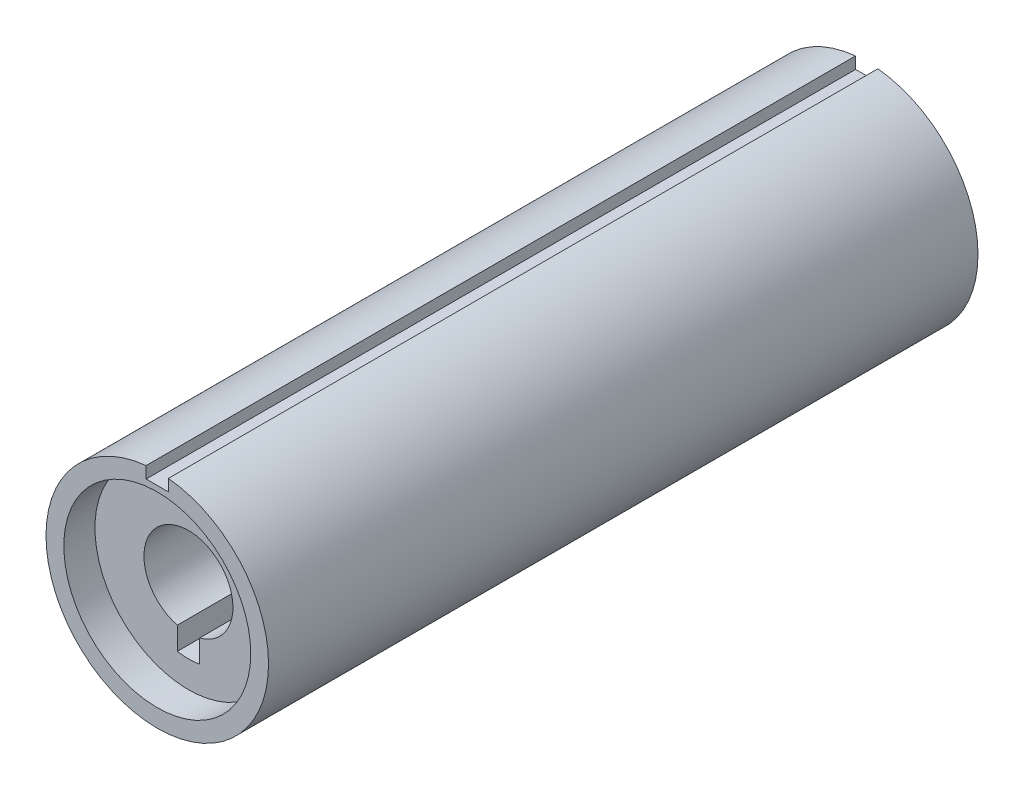
ISO-10303-21;
HEADER;
FILE_DESCRIPTION(('STEP AP214'),'2;1');
FILE_NAME('part.step','',(''),(''),'','','');
FILE_SCHEMA(('AUTOMOTIVE_DESIGN { 1 0 10303 214 1 1 1 1 }'));
ENDSEC;
DATA;
#1=APPLICATION_CONTEXT('core data for automotive mechanical design processes');
#2=APPLICATION_PROTOCOL_DEFINITION('international standard','automotive_design',2000,#1);
#3=PRODUCT_CONTEXT('',#1,'mechanical');
#4=PRODUCT('Part','Part','',(#3));
#5=PRODUCT_RELATED_PRODUCT_CATEGORY('part','',(#4));
#6=PRODUCT_DEFINITION_FORMATION('','',#4);
#7=PRODUCT_DEFINITION_CONTEXT('part definition',#1,'design');
#8=PRODUCT_DEFINITION('design','',#6,#7);
#9=PRODUCT_DEFINITION_SHAPE('','',#8);
#10=(LENGTH_UNIT() NAMED_UNIT(*) SI_UNIT(.MILLI.,.METRE.));
#11=(NAMED_UNIT(*) PLANE_ANGLE_UNIT() SI_UNIT($,.RADIAN.));
#12=(NAMED_UNIT(*) SI_UNIT($,.STERADIAN.) SOLID_ANGLE_UNIT());
#13=UNCERTAINTY_MEASURE_WITH_UNIT(LENGTH_MEASURE(1.E-05),#10,'distance_accuracy_value','');
#14=(GEOMETRIC_REPRESENTATION_CONTEXT(3) GLOBAL_UNCERTAINTY_ASSIGNED_CONTEXT((#13)) GLOBAL_UNIT_ASSIGNED_CONTEXT((#10,
#11,#12)) REPRESENTATION_CONTEXT('',''));
#15=CARTESIAN_POINT('',(0.,0.,0.));
#16=DIRECTION('',(0.,0.,1.));
#17=DIRECTION('',(1.,0.,0.));
#18=AXIS2_PLACEMENT_3D('',#15,#16,#17);
#19=CARTESIAN_POINT('',(0.,0.,152.4));
#20=DIRECTION('',(0.,0.,1.));
#21=DIRECTION('',(1.,0.,0.));
#22=AXIS2_PLACEMENT_3D('',#19,#20,#21);
#23=PLANE('',#22);
#24=DIRECTION('',(0.,-1.,0.));
#25=VECTOR('',#24,1.);
#26=CARTESIAN_POINT('',(2.5,0.,152.4));
#27=LINE('',#26,#25);
#28=CARTESIAN_POINT('',(2.5,-9.68245836551854,152.4));
#29=VERTEX_POINT('',#28);
#30=CARTESIAN_POINT('',(2.5,-14.790199457749,152.4));
#31=VERTEX_POINT('',#30);
#32=EDGE_CURVE('E154',#29,#31,#27,.T.);
#33=ORIENTED_EDGE('',*,*,#32,.T.);
#34=CARTESIAN_POINT('',(0.,0.,152.4));
#35=DIRECTION('',(0.,0.,-1.));
#36=DIRECTION('',(1.,0.,0.));
#37=AXIS2_PLACEMENT_3D('',#34,#35,#36);
#38=CIRCLE('',#37,15.);
#39=CARTESIAN_POINT('',(-2.5,-14.790199457749,152.4));
#40=VERTEX_POINT('',#39);
#41=EDGE_CURVE('E236',#31,#40,#38,.T.);
#42=ORIENTED_EDGE('',*,*,#41,.T.);
#43=DIRECTION('',(0.,-1.,0.));
#44=VECTOR('',#43,1.);
#45=CARTESIAN_POINT('',(-2.5,0.,152.4));
#46=LINE('',#45,#44);
#47=CARTESIAN_POINT('',(-2.5,-9.68245836551854,152.4));
#48=VERTEX_POINT('',#47);
#49=EDGE_CURVE('E72',#48,#40,#46,.T.);
#50=ORIENTED_EDGE('',*,*,#49,.F.);
#51=CARTESIAN_POINT('',(0.,0.,152.4));
#52=DIRECTION('',(0.,0.,1.));
#53=DIRECTION('',(1.,0.,0.));
#54=AXIS2_PLACEMENT_3D('',#51,#52,#53);
#55=CIRCLE('',#54,10.);
#56=EDGE_CURVE('E150',#29,#48,#55,.T.);
#57=ORIENTED_EDGE('',*,*,#56,.F.);
#58=EDGE_LOOP('',(#33,#42,#50,#57));
#59=FACE_BOUND('',#58,.T.);
#60=CARTESIAN_POINT('',(0.,0.,152.4));
#61=DIRECTION('',(0.,0.,1.));
#62=DIRECTION('',(1.,0.,0.));
#63=AXIS2_PLACEMENT_3D('',#60,#61,#62);
#64=CIRCLE('',#63,21.);
#65=CARTESIAN_POINT('',(21.,0.,152.4));
#66=VERTEX_POINT('',#65);
#67=EDGE_CURVE('E11',#66,#66,#64,.T.);
#68=ORIENTED_EDGE('',*,*,#67,.T.);
#69=EDGE_LOOP('',(#68));
#70=FACE_BOUND('',#69,.T.);
#71=ADVANCED_FACE('F47',(#59,#70),#23,.T.);
#72=CARTESIAN_POINT('',(0.,0.,152.4));
#73=DIRECTION('',(0.,0.,-1.));
#74=DIRECTION('',(-1.,0.,0.));
#75=AXIS2_PLACEMENT_3D('',#72,#73,#74);
#76=CYLINDRICAL_SURFACE('',#75,10.);
#77=CARTESIAN_POINT('',(0.,0.,0.));
#78=DIRECTION('',(0.,0.,1.));
#79=DIRECTION('',(1.,0.,0.));
#80=AXIS2_PLACEMENT_3D('',#77,#78,#79);
#81=CIRCLE('',#80,10.);
#82=CARTESIAN_POINT('',(2.5,-9.68245836551854,0.));
#83=VERTEX_POINT('',#82);
#84=CARTESIAN_POINT('',(-2.5,-9.68245836551854,0.));
#85=VERTEX_POINT('',#84);
#86=EDGE_CURVE('E149',#83,#85,#81,.T.);
#87=ORIENTED_EDGE('',*,*,#86,.F.);
#88=DIRECTION('',(0.,0.,-1.));
#89=VECTOR('',#88,1.);
#90=CARTESIAN_POINT('',(2.5,-9.68245836551854,152.4));
#91=LINE('',#90,#89);
#92=EDGE_CURVE('E51',#29,#83,#91,.T.);
#93=ORIENTED_EDGE('',*,*,#92,.F.);
#94=ORIENTED_EDGE('',*,*,#56,.T.);
#95=DIRECTION('',(0.,0.,-1.));
#96=VECTOR('',#95,1.);
#97=CARTESIAN_POINT('',(-2.5,-9.68245836551854,152.4));
#98=LINE('',#97,#96);
#99=EDGE_CURVE('E160',#48,#85,#98,.T.);
#100=ORIENTED_EDGE('',*,*,#99,.T.);
#101=EDGE_LOOP('',(#87,#93,#94,#100));
#102=FACE_BOUND('',#101,.T.);
#103=ADVANCED_FACE('F49',(#102),#76,.F.);
#104=CARTESIAN_POINT('',(2.5,0.,152.4));
#105=DIRECTION('',(1.,0.,0.));
#106=DIRECTION('',(0.,1.,0.));
#107=AXIS2_PLACEMENT_3D('',#104,#105,#106);
#108=PLANE('',#107);
#109=DIRECTION('',(0.,-1.,0.));
#110=VECTOR('',#109,1.);
#111=CARTESIAN_POINT('',(2.5,0.,0.));
#112=LINE('',#111,#110);
#113=CARTESIAN_POINT('',(2.5,-14.790199457749,0.));
#114=VERTEX_POINT('',#113);
#115=EDGE_CURVE('E164',#83,#114,#112,.T.);
#116=ORIENTED_EDGE('',*,*,#115,.T.);
#117=DIRECTION('',(0.,0.,1.));
#118=VECTOR('',#117,1.);
#119=CARTESIAN_POINT('',(2.5,-14.790199457749,-11.3683783853524));
#120=LINE('',#119,#118);
#121=EDGE_CURVE('E64',#114,#31,#120,.T.);
#122=ORIENTED_EDGE('',*,*,#121,.T.);
#123=ORIENTED_EDGE('',*,*,#32,.F.);
#124=ORIENTED_EDGE('',*,*,#92,.T.);
#125=EDGE_LOOP('',(#116,#122,#123,#124));
#126=FACE_BOUND('',#125,.T.);
#127=ADVANCED_FACE('F218',(#126),#108,.F.);
#128=CARTESIAN_POINT('',(2.5,0.,152.4));
#129=DIRECTION('',(-1.,0.,0.));
#130=DIRECTION('',(0.,0.,1.));
#131=AXIS2_PLACEMENT_3D('',#128,#129,#130);
#132=PLANE('',#131);
#133=DIRECTION('',(0.,1.,0.));
#134=VECTOR('',#133,1.);
#135=CARTESIAN_POINT('',(2.5,0.,0.));
#136=LINE('',#135,#134);
#137=CARTESIAN_POINT('',(2.5,22.25,0.));
#138=VERTEX_POINT('',#137);
#139=CARTESIAN_POINT('',(2.5,24.8746859276655,0.));
#140=VERTEX_POINT('',#139);
#141=EDGE_CURVE('E167',#138,#140,#136,.T.);
#142=ORIENTED_EDGE('',*,*,#141,.F.);
#143=DIRECTION('',(0.,0.,-1.));
#144=VECTOR('',#143,1.);
#145=CARTESIAN_POINT('',(2.5,22.25,152.4));
#146=LINE('',#145,#144);
#147=CARTESIAN_POINT('',(2.5,22.25,159.4));
#148=VERTEX_POINT('',#147);
#149=EDGE_CURVE('E126',#148,#138,#146,.T.);
#150=ORIENTED_EDGE('',*,*,#149,.F.);
#151=DIRECTION('',(0.,-1.,0.));
#152=VECTOR('',#151,1.);
#153=CARTESIAN_POINT('',(2.5,22.25,159.4));
#154=LINE('',#153,#152);
#155=CARTESIAN_POINT('',(2.5,24.8746859276655,159.4));
#156=VERTEX_POINT('',#155);
#157=EDGE_CURVE('E133',#156,#148,#154,.T.);
#158=ORIENTED_EDGE('',*,*,#157,.F.);
#159=DIRECTION('',(0.,0.,-1.));
#160=VECTOR('',#159,1.);
#161=CARTESIAN_POINT('',(2.5,24.8746859276655,152.4));
#162=LINE('',#161,#160);
#163=EDGE_CURVE('E115',#156,#140,#162,.T.);
#164=ORIENTED_EDGE('',*,*,#163,.T.);
#165=EDGE_LOOP('',(#142,#150,#158,#164));
#166=FACE_BOUND('',#165,.T.);
#167=ADVANCED_FACE('F140',(#166),#132,.T.);
#168=CARTESIAN_POINT('',(0.,22.25,152.4));
#169=DIRECTION('',(0.,1.,0.));
#170=DIRECTION('',(0.,0.,1.));
#171=AXIS2_PLACEMENT_3D('',#168,#169,#170);
#172=PLANE('',#171);
#173=DIRECTION('',(1.,0.,0.));
#174=VECTOR('',#173,1.);
#175=CARTESIAN_POINT('',(0.,22.25,0.));
#176=LINE('',#175,#174);
#177=CARTESIAN_POINT('',(-2.5,22.25,0.));
#178=VERTEX_POINT('',#177);
#179=EDGE_CURVE('E173',#178,#138,#176,.T.);
#180=ORIENTED_EDGE('',*,*,#179,.F.);
#181=DIRECTION('',(0.,0.,-1.));
#182=VECTOR('',#181,1.);
#183=CARTESIAN_POINT('',(-2.5,22.25,152.4));
#184=LINE('',#183,#182);
#185=CARTESIAN_POINT('',(-2.5,22.25,159.4));
#186=VERTEX_POINT('',#185);
#187=EDGE_CURVE('E188',#186,#178,#184,.T.);
#188=ORIENTED_EDGE('',*,*,#187,.F.);
#189=DIRECTION('',(-1.,0.,0.));
#190=VECTOR('',#189,1.);
#191=CARTESIAN_POINT('',(-2.5,22.25,159.4));
#192=LINE('',#191,#190);
#193=EDGE_CURVE('E142',#148,#186,#192,.T.);
#194=ORIENTED_EDGE('',*,*,#193,.F.);
#195=ORIENTED_EDGE('',*,*,#149,.T.);
#196=EDGE_LOOP('',(#180,#188,#194,#195));
#197=FACE_BOUND('',#196,.T.);
#198=ADVANCED_FACE('F194',(#197),#172,.T.);
#199=CARTESIAN_POINT('',(-2.5,0.,152.4));
#200=DIRECTION('',(1.,0.,0.));
#201=DIRECTION('',(0.,0.,-1.));
#202=AXIS2_PLACEMENT_3D('',#199,#200,#201);
#203=PLANE('',#202);
#204=DIRECTION('',(0.,-1.,0.));
#205=VECTOR('',#204,1.);
#206=CARTESIAN_POINT('',(-2.5,0.,0.));
#207=LINE('',#206,#205);
#208=CARTESIAN_POINT('',(-2.5,24.8746859276655,0.));
#209=VERTEX_POINT('',#208);
#210=EDGE_CURVE('E170',#209,#178,#207,.T.);
#211=ORIENTED_EDGE('',*,*,#210,.F.);
#212=DIRECTION('',(0.,0.,-1.));
#213=VECTOR('',#212,1.);
#214=CARTESIAN_POINT('',(-2.5,24.8746859276655,152.4));
#215=LINE('',#214,#213);
#216=CARTESIAN_POINT('',(-2.5,24.8746859276655,159.4));
#217=VERTEX_POINT('',#216);
#218=EDGE_CURVE('E185',#217,#209,#215,.T.);
#219=ORIENTED_EDGE('',*,*,#218,.F.);
#220=DIRECTION('',(0.,1.,0.));
#221=VECTOR('',#220,1.);
#222=CARTESIAN_POINT('',(-2.5,22.25,159.4));
#223=LINE('',#222,#221);
#224=EDGE_CURVE('E136',#186,#217,#223,.T.);
#225=ORIENTED_EDGE('',*,*,#224,.F.);
#226=ORIENTED_EDGE('',*,*,#187,.T.);
#227=EDGE_LOOP('',(#211,#219,#225,#226));
#228=FACE_BOUND('',#227,.T.);
#229=ADVANCED_FACE('F200',(#228),#203,.T.);
#230=CARTESIAN_POINT('',(0.,0.,152.4));
#231=DIRECTION('',(0.,0.,-1.));
#232=DIRECTION('',(-1.,0.,0.));
#233=AXIS2_PLACEMENT_3D('',#230,#231,#232);
#234=CYLINDRICAL_SURFACE('',#233,25.);
#235=CARTESIAN_POINT('',(0.,0.,0.));
#236=DIRECTION('',(0.,0.,1.));
#237=DIRECTION('',(1.,0.,0.));
#238=AXIS2_PLACEMENT_3D('',#235,#236,#237);
#239=CIRCLE('',#238,25.);
#240=EDGE_CURVE('E120',#209,#140,#239,.T.);
#241=ORIENTED_EDGE('',*,*,#240,.T.);
#242=ORIENTED_EDGE('',*,*,#163,.F.);
#243=CARTESIAN_POINT('',(0.,0.,159.4));
#244=DIRECTION('',(0.,0.,1.));
#245=DIRECTION('',(1.,0.,0.));
#246=AXIS2_PLACEMENT_3D('',#243,#244,#245);
#247=CIRCLE('',#246,25.);
#248=EDGE_CURVE('E118',#217,#156,#247,.T.);
#249=ORIENTED_EDGE('',*,*,#248,.F.);
#250=ORIENTED_EDGE('',*,*,#218,.T.);
#251=EDGE_LOOP('',(#241,#242,#249,#250));
#252=FACE_BOUND('',#251,.T.);
#253=ADVANCED_FACE('F117',(#252),#234,.T.);
#254=CARTESIAN_POINT('',(-2.5,0.,152.4));
#255=DIRECTION('',(1.,0.,0.));
#256=DIRECTION('',(0.,1.,0.));
#257=AXIS2_PLACEMENT_3D('',#254,#255,#256);
#258=PLANE('',#257);
#259=DIRECTION('',(0.,0.,1.));
#260=VECTOR('',#259,1.);
#261=CARTESIAN_POINT('',(-2.5,-14.790199457749,-11.3683783853524));
#262=LINE('',#261,#260);
#263=CARTESIAN_POINT('',(-2.5,-14.790199457749,0.));
#264=VERTEX_POINT('',#263);
#265=EDGE_CURVE('E230',#264,#40,#262,.T.);
#266=ORIENTED_EDGE('',*,*,#265,.F.);
#267=DIRECTION('',(0.,-1.,0.));
#268=VECTOR('',#267,1.);
#269=CARTESIAN_POINT('',(-2.5,0.,0.));
#270=LINE('',#269,#268);
#271=EDGE_CURVE('E155',#85,#264,#270,.T.);
#272=ORIENTED_EDGE('',*,*,#271,.F.);
#273=ORIENTED_EDGE('',*,*,#99,.F.);
#274=ORIENTED_EDGE('',*,*,#49,.T.);
#275=EDGE_LOOP('',(#266,#272,#273,#274));
#276=FACE_BOUND('',#275,.T.);
#277=ADVANCED_FACE('F208',(#276),#258,.T.);
#278=CARTESIAN_POINT('',(0.,0.,0.));
#279=DIRECTION('',(0.,0.,1.));
#280=DIRECTION('',(1.,0.,0.));
#281=AXIS2_PLACEMENT_3D('',#278,#279,#280);
#282=PLANE('',#281);
#283=ORIENTED_EDGE('',*,*,#141,.T.);
#284=ORIENTED_EDGE('',*,*,#240,.F.);
#285=ORIENTED_EDGE('',*,*,#210,.T.);
#286=ORIENTED_EDGE('',*,*,#179,.T.);
#287=EDGE_LOOP('',(#283,#284,#285,#286));
#288=FACE_BOUND('',#287,.T.);
#289=ORIENTED_EDGE('',*,*,#86,.T.);
#290=ORIENTED_EDGE('',*,*,#271,.T.);
#291=CARTESIAN_POINT('',(0.,0.,0.));
#292=DIRECTION('',(0.,0.,1.));
#293=DIRECTION('',(1.,0.,0.));
#294=AXIS2_PLACEMENT_3D('',#291,#292,#293);
#295=CIRCLE('',#294,15.);
#296=EDGE_CURVE('E240',#264,#114,#295,.T.);
#297=ORIENTED_EDGE('',*,*,#296,.T.);
#298=ORIENTED_EDGE('',*,*,#115,.F.);
#299=EDGE_LOOP('',(#289,#290,#297,#298));
#300=FACE_BOUND('',#299,.T.);
#301=ADVANCED_FACE('F196',(#288,#300),#282,.F.);
#302=CARTESIAN_POINT('',(0.,0.,159.4));
#303=DIRECTION('',(0.,0.,1.));
#304=DIRECTION('',(1.,0.,0.));
#305=AXIS2_PLACEMENT_3D('',#302,#303,#304);
#306=PLANE('',#305);
#307=ORIENTED_EDGE('',*,*,#248,.T.);
#308=ORIENTED_EDGE('',*,*,#157,.T.);
#309=ORIENTED_EDGE('',*,*,#193,.T.);
#310=ORIENTED_EDGE('',*,*,#224,.T.);
#311=EDGE_LOOP('',(#307,#308,#309,#310));
#312=FACE_BOUND('',#311,.T.);
#313=CARTESIAN_POINT('',(0.,0.,159.4));
#314=DIRECTION('',(0.,0.,1.));
#315=DIRECTION('',(1.,0.,0.));
#316=AXIS2_PLACEMENT_3D('',#313,#314,#315);
#317=CIRCLE('',#316,21.);
#318=CARTESIAN_POINT('',(21.,0.,159.4));
#319=VERTEX_POINT('',#318);
#320=EDGE_CURVE('E138',#319,#319,#317,.T.);
#321=ORIENTED_EDGE('',*,*,#320,.F.);
#322=EDGE_LOOP('',(#321));
#323=FACE_BOUND('',#322,.T.);
#324=ADVANCED_FACE('F130',(#312,#323),#306,.T.);
#325=CARTESIAN_POINT('',(0.,0.,159.4));
#326=DIRECTION('',(0.,0.,-1.));
#327=DIRECTION('',(-1.,0.,0.));
#328=AXIS2_PLACEMENT_3D('',#325,#326,#327);
#329=CYLINDRICAL_SURFACE('',#328,21.);
#330=ORIENTED_EDGE('',*,*,#320,.T.);
#331=EDGE_LOOP('',(#330));
#332=FACE_BOUND('',#331,.T.);
#333=ORIENTED_EDGE('',*,*,#67,.F.);
#334=EDGE_LOOP('',(#333));
#335=FACE_BOUND('',#334,.T.);
#336=ADVANCED_FACE('F299',(#332,#335),#329,.F.);
#337=CARTESIAN_POINT('',(0.,0.,-11.3683783853524));
#338=DIRECTION('',(0.,0.,1.));
#339=DIRECTION('',(1.,0.,0.));
#340=AXIS2_PLACEMENT_3D('',#337,#338,#339);
#341=CYLINDRICAL_SURFACE('',#340,15.);
#342=ORIENTED_EDGE('',*,*,#296,.F.);
#343=ORIENTED_EDGE('',*,*,#265,.T.);
#344=ORIENTED_EDGE('',*,*,#41,.F.);
#345=ORIENTED_EDGE('',*,*,#121,.F.);
#346=EDGE_LOOP('',(#342,#343,#344,#345));
#347=FACE_BOUND('',#346,.T.);
#348=ADVANCED_FACE('F242',(#347),#341,.F.);
#349=CLOSED_SHELL('',(#71,#103,#127,#167,#198,#229,#253,#277,#301,#324,#336,#348));
#350=MANIFOLD_SOLID_BREP('B2',#349);
#351=ADVANCED_BREP_SHAPE_REPRESENTATION('',(#18,#350),#14);
#352=SHAPE_DEFINITION_REPRESENTATION(#9,#351);
ENDSEC;
END-ISO-10303-21;
